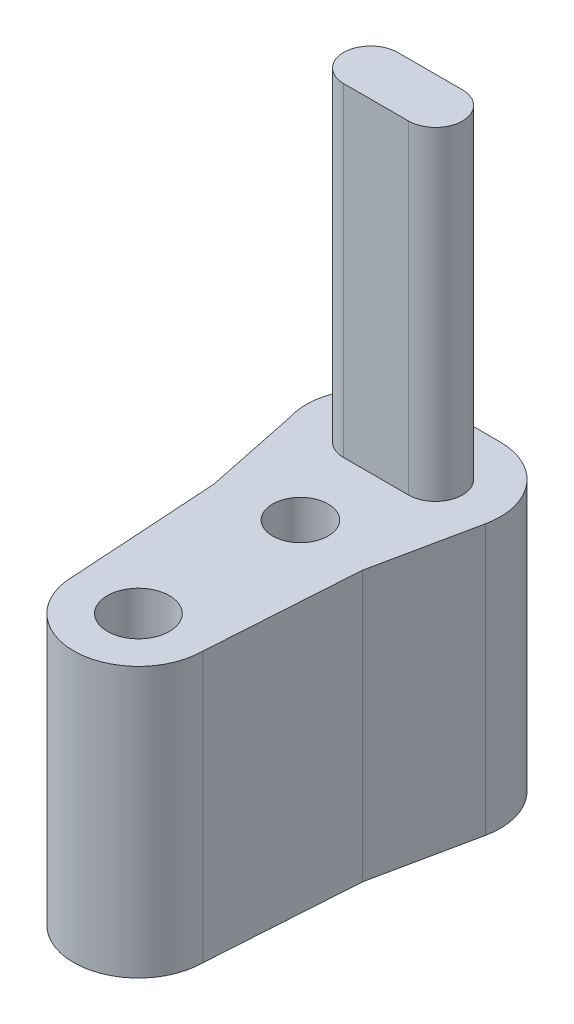
ISO-10303-21;
HEADER;
FILE_DESCRIPTION(('STEP AP214'),'2;1');
FILE_NAME('part.step','',(''),(''),'','','');
FILE_SCHEMA(('AUTOMOTIVE_DESIGN { 1 0 10303 214 1 1 1 1 }'));
ENDSEC;
DATA;
#1=APPLICATION_CONTEXT('core data for automotive mechanical design processes');
#2=APPLICATION_PROTOCOL_DEFINITION('international standard','automotive_design',2000,#1);
#3=PRODUCT_CONTEXT('',#1,'mechanical');
#4=PRODUCT('Part','Part','',(#3));
#5=PRODUCT_RELATED_PRODUCT_CATEGORY('part','',(#4));
#6=PRODUCT_DEFINITION_FORMATION('','',#4);
#7=PRODUCT_DEFINITION_CONTEXT('part definition',#1,'design');
#8=PRODUCT_DEFINITION('design','',#6,#7);
#9=PRODUCT_DEFINITION_SHAPE('','',#8);
#10=(LENGTH_UNIT() NAMED_UNIT(*) SI_UNIT(.MILLI.,.METRE.));
#11=(NAMED_UNIT(*) PLANE_ANGLE_UNIT() SI_UNIT($,.RADIAN.));
#12=(NAMED_UNIT(*) SI_UNIT($,.STERADIAN.) SOLID_ANGLE_UNIT());
#13=UNCERTAINTY_MEASURE_WITH_UNIT(LENGTH_MEASURE(1.E-05),#10,'distance_accuracy_value','');
#14=(GEOMETRIC_REPRESENTATION_CONTEXT(3) GLOBAL_UNCERTAINTY_ASSIGNED_CONTEXT((#13)) GLOBAL_UNIT_ASSIGNED_CONTEXT((#10,
#11,#12)) REPRESENTATION_CONTEXT('',''));
#15=CARTESIAN_POINT('',(0.,0.,0.));
#16=DIRECTION('',(0.,0.,1.));
#17=DIRECTION('',(1.,0.,0.));
#18=AXIS2_PLACEMENT_3D('',#15,#16,#17);
#19=CARTESIAN_POINT('',(0.,-7.41660919471891,-1.40263632888684));
#20=DIRECTION('',(0.,0.,1.));
#21=DIRECTION('',(1.,0.,0.));
#22=AXIS2_PLACEMENT_3D('',#19,#20,#21);
#23=PLANE('',#22);
#24=DIRECTION('',(1.,0.,0.));
#25=VECTOR('',#24,1.);
#26=CARTESIAN_POINT('',(-0.6,0.,-1.40263632888684));
#27=LINE('',#26,#25);
#28=CARTESIAN_POINT('',(-0.6,0.,-1.40263632888684));
#29=VERTEX_POINT('',#28);
#30=CARTESIAN_POINT('',(0.6,0.,-1.40263632888684));
#31=VERTEX_POINT('',#30);
#32=EDGE_CURVE('E138',#29,#31,#27,.T.);
#33=ORIENTED_EDGE('',*,*,#32,.T.);
#34=DIRECTION('',(0.,1.,0.));
#35=VECTOR('',#34,1.);
#36=CARTESIAN_POINT('',(0.6,-7.41660919471891,-1.40263632888684));
#37=LINE('',#36,#35);
#38=CARTESIAN_POINT('',(0.6,6.,-1.40263632888684));
#39=VERTEX_POINT('',#38);
#40=EDGE_CURVE('E40',#31,#39,#37,.T.);
#41=ORIENTED_EDGE('',*,*,#40,.T.);
#42=DIRECTION('',(1.,0.,0.));
#43=VECTOR('',#42,1.);
#44=CARTESIAN_POINT('',(0.,6.,-1.40263632888684));
#45=LINE('',#44,#43);
#46=CARTESIAN_POINT('',(-0.6,6.,-1.40263632888684));
#47=VERTEX_POINT('',#46);
#48=EDGE_CURVE('E208',#47,#39,#45,.T.);
#49=ORIENTED_EDGE('',*,*,#48,.F.);
#50=DIRECTION('',(0.,1.,0.));
#51=VECTOR('',#50,1.);
#52=CARTESIAN_POINT('',(-0.6,-7.41660919471891,-1.40263632888684));
#53=LINE('',#52,#51);
#54=EDGE_CURVE('E11',#29,#47,#53,.T.);
#55=ORIENTED_EDGE('',*,*,#54,.F.);
#56=EDGE_LOOP('',(#33,#41,#49,#55));
#57=FACE_BOUND('',#56,.T.);
#58=ADVANCED_FACE('F37',(#57),#23,.T.);
#59=CARTESIAN_POINT('',(-0.6,-7.41660919471891,-1.90263632888684));
#60=DIRECTION('',(0.,1.,0.));
#61=DIRECTION('',(0.,0.,1.));
#62=AXIS2_PLACEMENT_3D('',#59,#60,#61);
#63=CYLINDRICAL_SURFACE('',#62,0.5);
#64=CARTESIAN_POINT('',(-0.6,0.,-1.90263632888684));
#65=DIRECTION('',(0.,1.,0.));
#66=DIRECTION('',(0.,0.,1.));
#67=AXIS2_PLACEMENT_3D('',#64,#65,#66);
#68=CIRCLE('',#67,0.5);
#69=CARTESIAN_POINT('',(-0.6,0.,-2.40263632888684));
#70=VERTEX_POINT('',#69);
#71=EDGE_CURVE('E52',#70,#29,#68,.T.);
#72=ORIENTED_EDGE('',*,*,#71,.T.);
#73=ORIENTED_EDGE('',*,*,#54,.T.);
#74=CARTESIAN_POINT('',(-0.6,6.,-1.90263632888684));
#75=DIRECTION('',(0.,1.,0.));
#76=DIRECTION('',(0.,0.,1.));
#77=AXIS2_PLACEMENT_3D('',#74,#75,#76);
#78=CIRCLE('',#77,0.5);
#79=CARTESIAN_POINT('',(-0.6,6.,-2.40263632888684));
#80=VERTEX_POINT('',#79);
#81=EDGE_CURVE('E136',#80,#47,#78,.T.);
#82=ORIENTED_EDGE('',*,*,#81,.F.);
#83=DIRECTION('',(0.,1.,0.));
#84=VECTOR('',#83,1.);
#85=CARTESIAN_POINT('',(-0.6,-7.41660919471891,-2.40263632888684));
#86=LINE('',#85,#84);
#87=EDGE_CURVE('E45',#70,#80,#86,.T.);
#88=ORIENTED_EDGE('',*,*,#87,.F.);
#89=EDGE_LOOP('',(#72,#73,#82,#88));
#90=FACE_BOUND('',#89,.T.);
#91=ADVANCED_FACE('F235',(#90),#63,.T.);
#92=CARTESIAN_POINT('',(0.,-7.41660919471891,-2.40263632888684));
#93=DIRECTION('',(0.,0.,1.));
#94=DIRECTION('',(1.,0.,0.));
#95=AXIS2_PLACEMENT_3D('',#92,#93,#94);
#96=PLANE('',#95);
#97=DIRECTION('',(0.,1.,0.));
#98=VECTOR('',#97,1.);
#99=CARTESIAN_POINT('',(0.6,-7.41660919471891,-2.40263632888684));
#100=LINE('',#99,#98);
#101=CARTESIAN_POINT('',(0.6,0.,-2.40263632888684));
#102=VERTEX_POINT('',#101);
#103=CARTESIAN_POINT('',(0.6,6.,-2.40263632888684));
#104=VERTEX_POINT('',#103);
#105=EDGE_CURVE('E135',#102,#104,#100,.T.);
#106=ORIENTED_EDGE('',*,*,#105,.F.);
#107=DIRECTION('',(1.,0.,0.));
#108=VECTOR('',#107,1.);
#109=CARTESIAN_POINT('',(-0.6,0.,-2.40263632888684));
#110=LINE('',#109,#108);
#111=EDGE_CURVE('E60',#70,#102,#110,.T.);
#112=ORIENTED_EDGE('',*,*,#111,.F.);
#113=ORIENTED_EDGE('',*,*,#87,.T.);
#114=DIRECTION('',(1.,0.,0.));
#115=VECTOR('',#114,1.);
#116=CARTESIAN_POINT('',(0.,6.,-2.40263632888684));
#117=LINE('',#116,#115);
#118=EDGE_CURVE('E225',#80,#104,#117,.T.);
#119=ORIENTED_EDGE('',*,*,#118,.T.);
#120=EDGE_LOOP('',(#106,#112,#113,#119));
#121=FACE_BOUND('',#120,.T.);
#122=ADVANCED_FACE('F233',(#121),#96,.F.);
#123=CARTESIAN_POINT('',(0.6,-7.41660919471891,-1.90263632888684));
#124=DIRECTION('',(0.,1.,0.));
#125=DIRECTION('',(0.,0.,1.));
#126=AXIS2_PLACEMENT_3D('',#123,#124,#125);
#127=CYLINDRICAL_SURFACE('',#126,0.5);
#128=CARTESIAN_POINT('',(0.6,0.,-1.90263632888684));
#129=DIRECTION('',(0.,1.,0.));
#130=DIRECTION('',(0.,0.,1.));
#131=AXIS2_PLACEMENT_3D('',#128,#129,#130);
#132=CIRCLE('',#131,0.5);
#133=EDGE_CURVE('E129',#31,#102,#132,.T.);
#134=ORIENTED_EDGE('',*,*,#133,.T.);
#135=ORIENTED_EDGE('',*,*,#105,.T.);
#136=CARTESIAN_POINT('',(0.6,6.,-1.90263632888684));
#137=DIRECTION('',(0.,1.,0.));
#138=DIRECTION('',(0.,0.,1.));
#139=AXIS2_PLACEMENT_3D('',#136,#137,#138);
#140=CIRCLE('',#139,0.5);
#141=EDGE_CURVE('E131',#39,#104,#140,.T.);
#142=ORIENTED_EDGE('',*,*,#141,.F.);
#143=ORIENTED_EDGE('',*,*,#40,.F.);
#144=EDGE_LOOP('',(#134,#135,#142,#143));
#145=FACE_BOUND('',#144,.T.);
#146=ADVANCED_FACE('F127',(#145),#127,.T.);
#147=CARTESIAN_POINT('',(0.,6.,0.));
#148=DIRECTION('',(0.,1.,0.));
#149=DIRECTION('',(0.,0.,1.));
#150=AXIS2_PLACEMENT_3D('',#147,#148,#149);
#151=PLANE('',#150);
#152=ORIENTED_EDGE('',*,*,#48,.T.);
#153=ORIENTED_EDGE('',*,*,#141,.T.);
#154=ORIENTED_EDGE('',*,*,#118,.F.);
#155=ORIENTED_EDGE('',*,*,#81,.T.);
#156=EDGE_LOOP('',(#152,#153,#154,#155));
#157=FACE_BOUND('',#156,.T.);
#158=ADVANCED_FACE('F232',(#157),#151,.T.);
#159=CARTESIAN_POINT('',(0.,0.,0.));
#160=DIRECTION('',(0.,1.,0.));
#161=DIRECTION('',(0.,0.,1.));
#162=AXIS2_PLACEMENT_3D('',#159,#160,#161);
#163=PLANE('',#162);
#164=CARTESIAN_POINT('',(0.,0.,0.));
#165=DIRECTION('',(0.,1.,0.));
#166=DIRECTION('',(0.,0.,1.));
#167=AXIS2_PLACEMENT_3D('',#164,#165,#166);
#168=CIRCLE('',#167,0.515);
#169=CARTESIAN_POINT('',(0.,0.,0.515));
#170=VERTEX_POINT('',#169);
#171=EDGE_CURVE('E146',#170,#170,#168,.T.);
#172=ORIENTED_EDGE('',*,*,#171,.F.);
#173=EDGE_LOOP('',(#172));
#174=FACE_BOUND('',#173,.T.);
#175=CARTESIAN_POINT('',(0.,0.,3.));
#176=DIRECTION('',(0.,1.,0.));
#177=DIRECTION('',(0.,0.,1.));
#178=AXIS2_PLACEMENT_3D('',#175,#176,#177);
#179=CIRCLE('',#178,0.575);
#180=CARTESIAN_POINT('',(0.,0.,3.575));
#181=VERTEX_POINT('',#180);
#182=EDGE_CURVE('E180',#181,#181,#179,.T.);
#183=ORIENTED_EDGE('',*,*,#182,.F.);
#184=EDGE_LOOP('',(#183));
#185=FACE_BOUND('',#184,.T.);
#186=DIRECTION('',(0.204542628075845,0.,-0.978857657322977));
#187=VECTOR('',#186,1.);
#188=CARTESIAN_POINT('',(1.36858431225209,0.,0.285980121703282));
#189=LINE('',#188,#187);
#190=CARTESIAN_POINT('',(1.38030801958608,0.,0.229875236359576));
#191=VERTEX_POINT('',#190);
#192=CARTESIAN_POINT('',(1.77462918878757,0.,-1.65718517519583));
#193=VERTEX_POINT('',#192);
#194=EDGE_CURVE('E183',#191,#193,#189,.T.);
#195=ORIENTED_EDGE('',*,*,#194,.T.);
#196=CARTESIAN_POINT('',(0.6,0.,-1.90263632888684));
#197=DIRECTION('',(0.,1.,0.));
#198=DIRECTION('',(0.,0.,1.));
#199=AXIS2_PLACEMENT_3D('',#196,#197,#198);
#200=CIRCLE('',#199,1.2);
#201=CARTESIAN_POINT('',(0.6,0.,-3.10263632888684));
#202=VERTEX_POINT('',#201);
#203=EDGE_CURVE('E186',#193,#202,#200,.T.);
#204=ORIENTED_EDGE('',*,*,#203,.T.);
#205=DIRECTION('',(-1.,0.,0.));
#206=VECTOR('',#205,1.);
#207=CARTESIAN_POINT('',(0.,0.,-3.10263632888684));
#208=LINE('',#207,#206);
#209=CARTESIAN_POINT('',(-0.600000000000004,0.,-3.10263632888684));
#210=VERTEX_POINT('',#209);
#211=EDGE_CURVE('E189',#202,#210,#208,.T.);
#212=ORIENTED_EDGE('',*,*,#211,.T.);
#213=CARTESIAN_POINT('',(-0.6,0.,-1.90263632888684));
#214=DIRECTION('',(0.,1.,0.));
#215=DIRECTION('',(0.,0.,1.));
#216=AXIS2_PLACEMENT_3D('',#213,#214,#215);
#217=CIRCLE('',#216,1.2);
#218=CARTESIAN_POINT('',(-1.74043002516995,0.,-1.52924731232252));
#219=VERTEX_POINT('',#218);
#220=EDGE_CURVE('E192',#210,#219,#217,.T.);
#221=ORIENTED_EDGE('',*,*,#220,.T.);
#222=DIRECTION('',(-0.202915079921645,0.,-0.979196339015007));
#223=VECTOR('',#222,1.);
#224=CARTESIAN_POINT('',(-1.36491682559323,0.,0.282846448374439));
#225=LINE('',#224,#223);
#226=CARTESIAN_POINT('',(-1.37607705510717,0.,0.228991131722565));
#227=VERTEX_POINT('',#226);
#228=EDGE_CURVE('E195',#227,#219,#225,.T.);
#229=ORIENTED_EDGE('',*,*,#228,.F.);
#230=DIRECTION('',(-0.0634146863815828,0.,-0.997987263220892));
#231=VECTOR('',#230,1.);
#232=CARTESIAN_POINT('',(-1.38503544099125,0.,0.0880087265185839));
#233=LINE('',#232,#231);
#234=CARTESIAN_POINT('',(-1.2,0.,3.));
#235=VERTEX_POINT('',#234);
#236=EDGE_CURVE('E198',#235,#227,#233,.T.);
#237=ORIENTED_EDGE('',*,*,#236,.F.);
#238=CARTESIAN_POINT('',(0.,0.,3.));
#239=DIRECTION('',(0.,1.,0.));
#240=DIRECTION('',(0.,0.,1.));
#241=AXIS2_PLACEMENT_3D('',#238,#239,#240);
#242=CIRCLE('',#241,1.2);
#243=CARTESIAN_POINT('',(1.2,0.,3.));
#244=VERTEX_POINT('',#243);
#245=EDGE_CURVE('E201',#235,#244,#242,.T.);
#246=ORIENTED_EDGE('',*,*,#245,.T.);
#247=DIRECTION('',(0.0649527676919876,0.,-0.997888339429393));
#248=VECTOR('',#247,1.);
#249=CARTESIAN_POINT('',(1.38938419404348,0.,0.0904353174847487));
#250=LINE('',#249,#248);
#251=EDGE_CURVE('E151',#244,#191,#250,.T.);
#252=ORIENTED_EDGE('',*,*,#251,.T.);
#253=EDGE_LOOP('',(#195,#204,#212,#221,#229,#237,#246,#252));
#254=FACE_BOUND('',#253,.T.);
#255=ORIENTED_EDGE('',*,*,#71,.F.);
#256=ORIENTED_EDGE('',*,*,#111,.T.);
#257=ORIENTED_EDGE('',*,*,#133,.F.);
#258=ORIENTED_EDGE('',*,*,#32,.F.);
#259=EDGE_LOOP('',(#255,#256,#257,#258));
#260=FACE_BOUND('',#259,.T.);
#261=ADVANCED_FACE('F141',(#174,#185,#254,#260),#163,.T.);
#262=CARTESIAN_POINT('',(1.36858431225209,-5.,0.285980121703282));
#263=DIRECTION('',(0.978857657322977,0.,0.204542628075845));
#264=DIRECTION('',(0.204542628075845,0.,-0.978857657322977));
#265=AXIS2_PLACEMENT_3D('',#262,#263,#264);
#266=PLANE('',#265);
#267=ORIENTED_EDGE('',*,*,#194,.F.);
#268=DIRECTION('',(0.,1.,0.));
#269=VECTOR('',#268,1.);
#270=CARTESIAN_POINT('',(1.38030801958608,-5.,0.229875236359576));
#271=LINE('',#270,#269);
#272=CARTESIAN_POINT('',(1.38030801958608,-5.,0.229875236359576));
#273=VERTEX_POINT('',#272);
#274=EDGE_CURVE('E206',#273,#191,#271,.T.);
#275=ORIENTED_EDGE('',*,*,#274,.F.);
#276=DIRECTION('',(0.204542628075845,0.,-0.978857657322977));
#277=VECTOR('',#276,1.);
#278=CARTESIAN_POINT('',(1.36858431225209,-5.,0.285980121703282));
#279=LINE('',#278,#277);
#280=CARTESIAN_POINT('',(1.77462918878757,-5.,-1.65718517519583));
#281=VERTEX_POINT('',#280);
#282=EDGE_CURVE('E154',#273,#281,#279,.T.);
#283=ORIENTED_EDGE('',*,*,#282,.T.);
#284=DIRECTION('',(0.,1.,0.));
#285=VECTOR('',#284,1.);
#286=CARTESIAN_POINT('',(1.77462918878757,-5.,-1.65718517519583));
#287=LINE('',#286,#285);
#288=EDGE_CURVE('E177',#281,#193,#287,.T.);
#289=ORIENTED_EDGE('',*,*,#288,.T.);
#290=EDGE_LOOP('',(#267,#275,#283,#289));
#291=FACE_BOUND('',#290,.T.);
#292=ADVANCED_FACE('F253',(#291),#266,.T.);
#293=CARTESIAN_POINT('',(1.38938419404348,-5.,0.0904353174847487));
#294=DIRECTION('',(0.997888339429393,0.,0.0649527676919876));
#295=DIRECTION('',(0.0649527676919876,0.,-0.997888339429393));
#296=AXIS2_PLACEMENT_3D('',#293,#294,#295);
#297=PLANE('',#296);
#298=ORIENTED_EDGE('',*,*,#251,.F.);
#299=DIRECTION('',(0.,1.,0.));
#300=VECTOR('',#299,1.);
#301=CARTESIAN_POINT('',(1.2,-5.,3.));
#302=LINE('',#301,#300);
#303=CARTESIAN_POINT('',(1.2,-5.,3.));
#304=VERTEX_POINT('',#303);
#305=EDGE_CURVE('E209',#304,#244,#302,.T.);
#306=ORIENTED_EDGE('',*,*,#305,.F.);
#307=DIRECTION('',(0.0649527676919876,0.,-0.997888339429393));
#308=VECTOR('',#307,1.);
#309=CARTESIAN_POINT('',(1.38938419404348,-5.,0.0904353174847487));
#310=LINE('',#309,#308);
#311=EDGE_CURVE('E174',#304,#273,#310,.T.);
#312=ORIENTED_EDGE('',*,*,#311,.T.);
#313=ORIENTED_EDGE('',*,*,#274,.T.);
#314=EDGE_LOOP('',(#298,#306,#312,#313));
#315=FACE_BOUND('',#314,.T.);
#316=ADVANCED_FACE('F269',(#315),#297,.T.);
#317=CARTESIAN_POINT('',(0.,-5.,3.));
#318=DIRECTION('',(0.,1.,0.));
#319=DIRECTION('',(0.,0.,1.));
#320=AXIS2_PLACEMENT_3D('',#317,#318,#319);
#321=CYLINDRICAL_SURFACE('',#320,1.2);
#322=ORIENTED_EDGE('',*,*,#245,.F.);
#323=DIRECTION('',(0.,1.,0.));
#324=VECTOR('',#323,1.);
#325=CARTESIAN_POINT('',(-1.2,-5.,3.));
#326=LINE('',#325,#324);
#327=CARTESIAN_POINT('',(-1.2,-5.,3.));
#328=VERTEX_POINT('',#327);
#329=EDGE_CURVE('E211',#328,#235,#326,.T.);
#330=ORIENTED_EDGE('',*,*,#329,.F.);
#331=CARTESIAN_POINT('',(0.,-5.,3.));
#332=DIRECTION('',(0.,1.,0.));
#333=DIRECTION('',(0.,0.,1.));
#334=AXIS2_PLACEMENT_3D('',#331,#332,#333);
#335=CIRCLE('',#334,1.2);
#336=EDGE_CURVE('E171',#328,#304,#335,.T.);
#337=ORIENTED_EDGE('',*,*,#336,.T.);
#338=ORIENTED_EDGE('',*,*,#305,.T.);
#339=EDGE_LOOP('',(#322,#330,#337,#338));
#340=FACE_BOUND('',#339,.T.);
#341=ADVANCED_FACE('F288',(#340),#321,.T.);
#342=CARTESIAN_POINT('',(-1.38503544099125,-5.,0.0880087265185839));
#343=DIRECTION('',(0.997987263220892,0.,-0.0634146863815828));
#344=DIRECTION('',(-0.0634146863815828,0.,-0.997987263220892));
#345=AXIS2_PLACEMENT_3D('',#342,#343,#344);
#346=PLANE('',#345);
#347=ORIENTED_EDGE('',*,*,#236,.T.);
#348=DIRECTION('',(0.,1.,0.));
#349=VECTOR('',#348,1.);
#350=CARTESIAN_POINT('',(-1.37607705510717,-5.,0.228991131722565));
#351=LINE('',#350,#349);
#352=CARTESIAN_POINT('',(-1.37607705510717,-5.,0.228991131722565));
#353=VERTEX_POINT('',#352);
#354=EDGE_CURVE('E213',#353,#227,#351,.T.);
#355=ORIENTED_EDGE('',*,*,#354,.F.);
#356=DIRECTION('',(-0.0634146863815828,0.,-0.997987263220892));
#357=VECTOR('',#356,1.);
#358=CARTESIAN_POINT('',(-1.38503544099125,-5.,0.0880087265185839));
#359=LINE('',#358,#357);
#360=EDGE_CURVE('E168',#328,#353,#359,.T.);
#361=ORIENTED_EDGE('',*,*,#360,.F.);
#362=ORIENTED_EDGE('',*,*,#329,.T.);
#363=EDGE_LOOP('',(#347,#355,#361,#362));
#364=FACE_BOUND('',#363,.T.);
#365=ADVANCED_FACE('F284',(#364),#346,.F.);
#366=CARTESIAN_POINT('',(-1.36491682559323,-5.,0.282846448374439));
#367=DIRECTION('',(0.979196339015007,0.,-0.202915079921645));
#368=DIRECTION('',(-0.202915079921645,0.,-0.979196339015007));
#369=AXIS2_PLACEMENT_3D('',#366,#367,#368);
#370=PLANE('',#369);
#371=ORIENTED_EDGE('',*,*,#228,.T.);
#372=DIRECTION('',(0.,1.,0.));
#373=VECTOR('',#372,1.);
#374=CARTESIAN_POINT('',(-1.74043002516995,-5.,-1.52924731232252));
#375=LINE('',#374,#373);
#376=CARTESIAN_POINT('',(-1.74043002516995,-5.,-1.52924731232252));
#377=VERTEX_POINT('',#376);
#378=EDGE_CURVE('E216',#377,#219,#375,.T.);
#379=ORIENTED_EDGE('',*,*,#378,.F.);
#380=DIRECTION('',(-0.202915079921645,0.,-0.979196339015007));
#381=VECTOR('',#380,1.);
#382=CARTESIAN_POINT('',(-1.36491682559323,-5.,0.282846448374439));
#383=LINE('',#382,#381);
#384=EDGE_CURVE('E166',#353,#377,#383,.T.);
#385=ORIENTED_EDGE('',*,*,#384,.F.);
#386=ORIENTED_EDGE('',*,*,#354,.T.);
#387=EDGE_LOOP('',(#371,#379,#385,#386));
#388=FACE_BOUND('',#387,.T.);
#389=ADVANCED_FACE('F280',(#388),#370,.F.);
#390=CARTESIAN_POINT('',(-0.6,-5.,-1.90263632888684));
#391=DIRECTION('',(0.,1.,0.));
#392=DIRECTION('',(0.,0.,1.));
#393=AXIS2_PLACEMENT_3D('',#390,#391,#392);
#394=CYLINDRICAL_SURFACE('',#393,1.2);
#395=ORIENTED_EDGE('',*,*,#220,.F.);
#396=DIRECTION('',(0.,1.,0.));
#397=VECTOR('',#396,1.);
#398=CARTESIAN_POINT('',(-0.600000000000004,-5.,-3.10263632888684));
#399=LINE('',#398,#397);
#400=CARTESIAN_POINT('',(-0.600000000000004,-5.,-3.10263632888684));
#401=VERTEX_POINT('',#400);
#402=EDGE_CURVE('E218',#401,#210,#399,.T.);
#403=ORIENTED_EDGE('',*,*,#402,.F.);
#404=CARTESIAN_POINT('',(-0.6,-5.,-1.90263632888684));
#405=DIRECTION('',(0.,1.,0.));
#406=DIRECTION('',(0.,0.,1.));
#407=AXIS2_PLACEMENT_3D('',#404,#405,#406);
#408=CIRCLE('',#407,1.2);
#409=EDGE_CURVE('E163',#401,#377,#408,.T.);
#410=ORIENTED_EDGE('',*,*,#409,.T.);
#411=ORIENTED_EDGE('',*,*,#378,.T.);
#412=EDGE_LOOP('',(#395,#403,#410,#411));
#413=FACE_BOUND('',#412,.T.);
#414=ADVANCED_FACE('F276',(#413),#394,.T.);
#415=CARTESIAN_POINT('',(0.,-5.,-3.10263632888684));
#416=DIRECTION('',(0.,0.,-1.));
#417=DIRECTION('',(-1.,0.,0.));
#418=AXIS2_PLACEMENT_3D('',#415,#416,#417);
#419=PLANE('',#418);
#420=ORIENTED_EDGE('',*,*,#211,.F.);
#421=DIRECTION('',(0.,1.,0.));
#422=VECTOR('',#421,1.);
#423=CARTESIAN_POINT('',(0.6,-5.,-3.10263632888684));
#424=LINE('',#423,#422);
#425=CARTESIAN_POINT('',(0.6,-5.,-3.10263632888684));
#426=VERTEX_POINT('',#425);
#427=EDGE_CURVE('E220',#426,#202,#424,.T.);
#428=ORIENTED_EDGE('',*,*,#427,.F.);
#429=DIRECTION('',(-1.,0.,0.));
#430=VECTOR('',#429,1.);
#431=CARTESIAN_POINT('',(0.,-5.,-3.10263632888684));
#432=LINE('',#431,#430);
#433=EDGE_CURVE('E160',#426,#401,#432,.T.);
#434=ORIENTED_EDGE('',*,*,#433,.T.);
#435=ORIENTED_EDGE('',*,*,#402,.T.);
#436=EDGE_LOOP('',(#420,#428,#434,#435));
#437=FACE_BOUND('',#436,.T.);
#438=ADVANCED_FACE('F265',(#437),#419,.T.);
#439=CARTESIAN_POINT('',(0.,-5.,3.));
#440=DIRECTION('',(0.,1.,0.));
#441=DIRECTION('',(0.,0.,1.));
#442=AXIS2_PLACEMENT_3D('',#439,#440,#441);
#443=CYLINDRICAL_SURFACE('',#442,0.575);
#444=CARTESIAN_POINT('',(0.,-5.,3.));
#445=DIRECTION('',(0.,1.,0.));
#446=DIRECTION('',(0.,0.,1.));
#447=AXIS2_PLACEMENT_3D('',#444,#445,#446);
#448=CIRCLE('',#447,0.575);
#449=CARTESIAN_POINT('',(0.,-5.,3.575));
#450=VERTEX_POINT('',#449);
#451=EDGE_CURVE('E150',#450,#450,#448,.T.);
#452=ORIENTED_EDGE('',*,*,#451,.F.);
#453=EDGE_LOOP('',(#452));
#454=FACE_BOUND('',#453,.T.);
#455=ORIENTED_EDGE('',*,*,#182,.T.);
#456=EDGE_LOOP('',(#455));
#457=FACE_BOUND('',#456,.T.);
#458=ADVANCED_FACE('F261',(#454,#457),#443,.F.);
#459=CARTESIAN_POINT('',(0.,-5.,0.));
#460=DIRECTION('',(0.,1.,0.));
#461=DIRECTION('',(0.,0.,1.));
#462=AXIS2_PLACEMENT_3D('',#459,#460,#461);
#463=CYLINDRICAL_SURFACE('',#462,0.515);
#464=CARTESIAN_POINT('',(0.,-5.,0.));
#465=DIRECTION('',(0.,1.,0.));
#466=DIRECTION('',(0.,0.,1.));
#467=AXIS2_PLACEMENT_3D('',#464,#465,#466);
#468=CIRCLE('',#467,0.515);
#469=CARTESIAN_POINT('',(0.,-5.,0.515));
#470=VERTEX_POINT('',#469);
#471=EDGE_CURVE('E147',#470,#470,#468,.T.);
#472=ORIENTED_EDGE('',*,*,#471,.F.);
#473=EDGE_LOOP('',(#472));
#474=FACE_BOUND('',#473,.T.);
#475=ORIENTED_EDGE('',*,*,#171,.T.);
#476=EDGE_LOOP('',(#475));
#477=FACE_BOUND('',#476,.T.);
#478=ADVANCED_FACE('F257',(#474,#477),#463,.F.);
#479=CARTESIAN_POINT('',(0.6,-5.,-1.90263632888684));
#480=DIRECTION('',(0.,1.,0.));
#481=DIRECTION('',(0.,0.,1.));
#482=AXIS2_PLACEMENT_3D('',#479,#480,#481);
#483=CYLINDRICAL_SURFACE('',#482,1.2);
#484=ORIENTED_EDGE('',*,*,#203,.F.);
#485=ORIENTED_EDGE('',*,*,#288,.F.);
#486=CARTESIAN_POINT('',(0.6,-5.,-1.90263632888684));
#487=DIRECTION('',(0.,1.,0.));
#488=DIRECTION('',(0.,0.,1.));
#489=AXIS2_PLACEMENT_3D('',#486,#487,#488);
#490=CIRCLE('',#489,1.2);
#491=EDGE_CURVE('E157',#281,#426,#490,.T.);
#492=ORIENTED_EDGE('',*,*,#491,.T.);
#493=ORIENTED_EDGE('',*,*,#427,.T.);
#494=EDGE_LOOP('',(#484,#485,#492,#493));
#495=FACE_BOUND('',#494,.T.);
#496=ADVANCED_FACE('F260',(#495),#483,.T.);
#497=CARTESIAN_POINT('',(0.,-5.,0.));
#498=DIRECTION('',(0.,1.,0.));
#499=DIRECTION('',(0.,0.,1.));
#500=AXIS2_PLACEMENT_3D('',#497,#498,#499);
#501=PLANE('',#500);
#502=ORIENTED_EDGE('',*,*,#282,.F.);
#503=ORIENTED_EDGE('',*,*,#311,.F.);
#504=ORIENTED_EDGE('',*,*,#336,.F.);
#505=ORIENTED_EDGE('',*,*,#360,.T.);
#506=ORIENTED_EDGE('',*,*,#384,.T.);
#507=ORIENTED_EDGE('',*,*,#409,.F.);
#508=ORIENTED_EDGE('',*,*,#433,.F.);
#509=ORIENTED_EDGE('',*,*,#491,.F.);
#510=EDGE_LOOP('',(#502,#503,#504,#505,#506,#507,#508,#509));
#511=FACE_BOUND('',#510,.T.);
#512=ORIENTED_EDGE('',*,*,#451,.T.);
#513=EDGE_LOOP('',(#512));
#514=FACE_BOUND('',#513,.T.);
#515=ORIENTED_EDGE('',*,*,#471,.T.);
#516=EDGE_LOOP('',(#515));
#517=FACE_BOUND('',#516,.T.);
#518=ADVANCED_FACE('F244',(#511,#514,#517),#501,.F.);
#519=CLOSED_SHELL('',(#58,#91,#122,#146,#158,#261,#292,#316,#341,#365,#389,#414,#438,#458,#478,
#496,#518));
#520=MANIFOLD_SOLID_BREP('B2',#519);
#521=ADVANCED_BREP_SHAPE_REPRESENTATION('',(#18,#520),#14);
#522=SHAPE_DEFINITION_REPRESENTATION(#9,#521);
ENDSEC;
END-ISO-10303-21;
